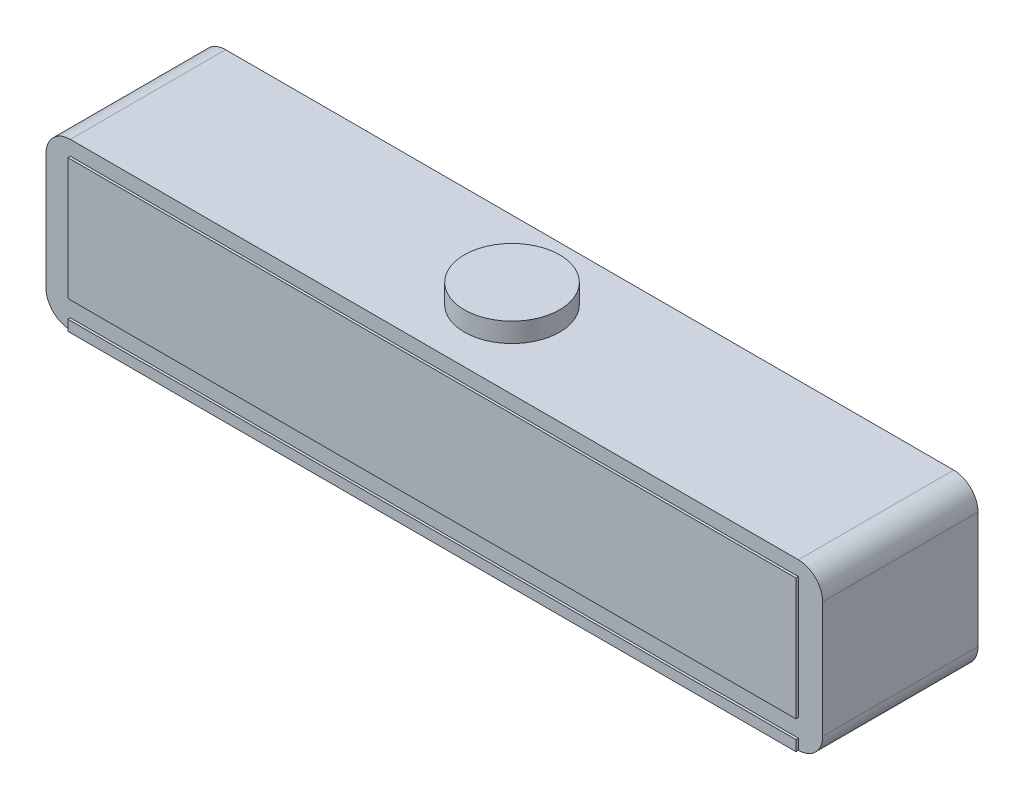
ISO-10303-21;
HEADER;
FILE_DESCRIPTION(('STEP AP214'),'2;1');
FILE_NAME('part.step','',(''),(''),'','','');
FILE_SCHEMA(('AUTOMOTIVE_DESIGN { 1 0 10303 214 1 1 1 1 }'));
ENDSEC;
DATA;
#1=APPLICATION_CONTEXT('core data for automotive mechanical design processes');
#2=APPLICATION_PROTOCOL_DEFINITION('international standard','automotive_design',2000,#1);
#3=PRODUCT_CONTEXT('',#1,'mechanical');
#4=PRODUCT('Part','Part','',(#3));
#5=PRODUCT_RELATED_PRODUCT_CATEGORY('part','',(#4));
#6=PRODUCT_DEFINITION_FORMATION('','',#4);
#7=PRODUCT_DEFINITION_CONTEXT('part definition',#1,'design');
#8=PRODUCT_DEFINITION('design','',#6,#7);
#9=PRODUCT_DEFINITION_SHAPE('','',#8);
#10=(LENGTH_UNIT() NAMED_UNIT(*) SI_UNIT(.MILLI.,.METRE.));
#11=(NAMED_UNIT(*) PLANE_ANGLE_UNIT() SI_UNIT($,.RADIAN.));
#12=(NAMED_UNIT(*) SI_UNIT($,.STERADIAN.) SOLID_ANGLE_UNIT());
#13=UNCERTAINTY_MEASURE_WITH_UNIT(LENGTH_MEASURE(1.E-05),#10,'distance_accuracy_value','');
#14=(GEOMETRIC_REPRESENTATION_CONTEXT(3) GLOBAL_UNCERTAINTY_ASSIGNED_CONTEXT((#13)) GLOBAL_UNIT_ASSIGNED_CONTEXT((#10,
#11,#12)) REPRESENTATION_CONTEXT('',''));
#15=CARTESIAN_POINT('',(0.,0.,0.));
#16=DIRECTION('',(0.,0.,1.));
#17=DIRECTION('',(1.,0.,0.));
#18=AXIS2_PLACEMENT_3D('',#15,#16,#17);
#19=CARTESIAN_POINT('',(-133.577981651376,68.,65.6880733944954));
#20=DIRECTION('',(0.,0.,-1.));
#21=DIRECTION('',(-1.,0.,0.));
#22=AXIS2_PLACEMENT_3D('',#19,#20,#21);
#23=PLANE('',#22);
#24=DIRECTION('',(0.,-1.,0.));
#25=VECTOR('',#24,1.);
#26=CARTESIAN_POINT('',(-123.577981651376,62.,65.6880733944954));
#27=LINE('',#26,#25);
#28=CARTESIAN_POINT('',(-123.577981651376,62.,65.6880733944954));
#29=VERTEX_POINT('',#28);
#30=CARTESIAN_POINT('',(-123.577981651376,11.7120477058628,65.6880733944954));
#31=VERTEX_POINT('',#30);
#32=EDGE_CURVE('E173',#29,#31,#27,.T.);
#33=ORIENTED_EDGE('',*,*,#32,.F.);
#34=DIRECTION('',(-1.,0.,0.));
#35=VECTOR('',#34,1.);
#36=CARTESIAN_POINT('',(-123.577981651376,62.,65.6880733944954));
#37=LINE('',#36,#35);
#38=CARTESIAN_POINT('',(176.422018348624,62.,65.6880733944954));
#39=VERTEX_POINT('',#38);
#40=EDGE_CURVE('E189',#39,#29,#37,.T.);
#41=ORIENTED_EDGE('',*,*,#40,.F.);
#42=DIRECTION('',(0.,1.,0.));
#43=VECTOR('',#42,1.);
#44=CARTESIAN_POINT('',(176.422018348624,62.,65.6880733944954));
#45=LINE('',#44,#43);
#46=CARTESIAN_POINT('',(176.422018348624,11.7120477058628,65.6880733944954));
#47=VERTEX_POINT('',#46);
#48=EDGE_CURVE('E202',#47,#39,#45,.T.);
#49=ORIENTED_EDGE('',*,*,#48,.F.);
#50=DIRECTION('',(1.,0.,0.));
#51=VECTOR('',#50,1.);
#52=CARTESIAN_POINT('',(-123.577981651376,11.7120477058628,65.6880733944954));
#53=LINE('',#52,#51);
#54=EDGE_CURVE('E178',#31,#47,#53,.T.);
#55=ORIENTED_EDGE('',*,*,#54,.F.);
#56=EDGE_LOOP('',(#33,#41,#49,#55));
#57=FACE_BOUND('',#56,.T.);
#58=DIRECTION('',(0.,-1.,0.));
#59=VECTOR('',#58,1.);
#60=CARTESIAN_POINT('',(-123.577981651376,4.34472349604082,65.6880733944954));
#61=LINE('',#60,#59);
#62=CARTESIAN_POINT('',(-123.577981651376,4.34472349604081,65.6880733944954));
#63=VERTEX_POINT('',#62);
#64=CARTESIAN_POINT('',(-123.577981651376,0.,65.6880733944954));
#65=VERTEX_POINT('',#64);
#66=EDGE_CURVE('E56',#63,#65,#61,.T.);
#67=ORIENTED_EDGE('',*,*,#66,.F.);
#68=DIRECTION('',(-1.,0.,0.));
#69=VECTOR('',#68,1.);
#70=CARTESIAN_POINT('',(-123.577981651376,4.34472349604082,65.6880733944954));
#71=LINE('',#70,#69);
#72=CARTESIAN_POINT('',(176.422018348624,4.34472349604081,65.6880733944954));
#73=VERTEX_POINT('',#72);
#74=EDGE_CURVE('E60',#73,#63,#71,.T.);
#75=ORIENTED_EDGE('',*,*,#74,.F.);
#76=DIRECTION('',(0.,1.,0.));
#77=VECTOR('',#76,1.);
#78=CARTESIAN_POINT('',(176.422018348624,4.34472349604082,65.6880733944954));
#79=LINE('',#78,#77);
#80=CARTESIAN_POINT('',(176.422018348624,0.,65.6880733944954));
#81=VERTEX_POINT('',#80);
#82=EDGE_CURVE('E527',#81,#73,#79,.T.);
#83=ORIENTED_EDGE('',*,*,#82,.F.);
#84=CARTESIAN_POINT('',(176.422018348624,10.,65.6880733944954));
#85=DIRECTION('',(0.,0.,-1.));
#86=DIRECTION('',(-1.,0.,0.));
#87=AXIS2_PLACEMENT_3D('',#84,#85,#86);
#88=CIRCLE('',#87,10.);
#89=CARTESIAN_POINT('',(186.422018348624,10.,65.6880733944954));
#90=VERTEX_POINT('',#89);
#91=EDGE_CURVE('E294',#81,#90,#88,.F.);
#92=ORIENTED_EDGE('',*,*,#91,.T.);
#93=DIRECTION('',(0.,-1.,0.));
#94=VECTOR('',#93,1.);
#95=CARTESIAN_POINT('',(186.422018348624,68.,65.6880733944954));
#96=LINE('',#95,#94);
#97=CARTESIAN_POINT('',(186.422018348624,58.,65.6880733944954));
#98=VERTEX_POINT('',#97);
#99=EDGE_CURVE('E252',#98,#90,#96,.T.);
#100=ORIENTED_EDGE('',*,*,#99,.F.);
#101=CARTESIAN_POINT('',(176.422018348624,58.,65.6880733944954));
#102=DIRECTION('',(0.,0.,-1.));
#103=DIRECTION('',(-1.,0.,0.));
#104=AXIS2_PLACEMENT_3D('',#101,#102,#103);
#105=CIRCLE('',#104,10.);
#106=CARTESIAN_POINT('',(176.422018348624,68.,65.6880733944954));
#107=VERTEX_POINT('',#106);
#108=EDGE_CURVE('E291',#98,#107,#105,.F.);
#109=ORIENTED_EDGE('',*,*,#108,.T.);
#110=DIRECTION('',(1.,0.,0.));
#111=VECTOR('',#110,1.);
#112=CARTESIAN_POINT('',(-133.577981651376,68.,65.6880733944954));
#113=LINE('',#112,#111);
#114=CARTESIAN_POINT('',(-123.577981651376,68.,65.6880733944954));
#115=VERTEX_POINT('',#114);
#116=EDGE_CURVE('E233',#115,#107,#113,.T.);
#117=ORIENTED_EDGE('',*,*,#116,.F.);
#118=CARTESIAN_POINT('',(-123.577981651376,58.,65.6880733944954));
#119=DIRECTION('',(0.,0.,-1.));
#120=DIRECTION('',(-1.,0.,0.));
#121=AXIS2_PLACEMENT_3D('',#118,#119,#120);
#122=CIRCLE('',#121,10.);
#123=CARTESIAN_POINT('',(-133.577981651376,58.,65.6880733944954));
#124=VERTEX_POINT('',#123);
#125=EDGE_CURVE('E285',#115,#124,#122,.F.);
#126=ORIENTED_EDGE('',*,*,#125,.T.);
#127=DIRECTION('',(0.,-1.,0.));
#128=VECTOR('',#127,1.);
#129=CARTESIAN_POINT('',(-133.577981651376,68.,65.6880733944954));
#130=LINE('',#129,#128);
#131=CARTESIAN_POINT('',(-133.577981651376,10.,65.6880733944954));
#132=VERTEX_POINT('',#131);
#133=EDGE_CURVE('E256',#124,#132,#130,.T.);
#134=ORIENTED_EDGE('',*,*,#133,.T.);
#135=CARTESIAN_POINT('',(-123.577981651376,10.,65.6880733944954));
#136=DIRECTION('',(0.,0.,-1.));
#137=DIRECTION('',(-1.,0.,0.));
#138=AXIS2_PLACEMENT_3D('',#135,#136,#137);
#139=CIRCLE('',#138,10.);
#140=EDGE_CURVE('E288',#132,#65,#139,.F.);
#141=ORIENTED_EDGE('',*,*,#140,.T.);
#142=EDGE_LOOP('',(#67,#75,#83,#92,#100,#109,#117,#126,#134,#141));
#143=FACE_BOUND('',#142,.T.);
#144=ADVANCED_FACE('F40',(#57,#143),#23,.F.);
#145=CARTESIAN_POINT('',(-133.577981651376,68.,1.68807339449543));
#146=DIRECTION('',(1.,0.,0.));
#147=DIRECTION('',(0.,0.,-1.));
#148=AXIS2_PLACEMENT_3D('',#145,#146,#147);
#149=PLANE('',#148);
#150=DIRECTION('',(0.,-1.,0.));
#151=VECTOR('',#150,1.);
#152=CARTESIAN_POINT('',(-133.577981651376,68.,1.68807339449543));
#153=LINE('',#152,#151);
#154=CARTESIAN_POINT('',(-133.577981651376,58.,1.68807339449543));
#155=VERTEX_POINT('',#154);
#156=CARTESIAN_POINT('',(-133.577981651376,10.,1.68807339449543));
#157=VERTEX_POINT('',#156);
#158=EDGE_CURVE('E241',#155,#157,#153,.T.);
#159=ORIENTED_EDGE('',*,*,#158,.T.);
#160=DIRECTION('',(0.,0.,1.));
#161=VECTOR('',#160,1.);
#162=CARTESIAN_POINT('',(-133.577981651376,10.,1.68807339449543));
#163=LINE('',#162,#161);
#164=EDGE_CURVE('E11',#157,#132,#163,.T.);
#165=ORIENTED_EDGE('',*,*,#164,.T.);
#166=ORIENTED_EDGE('',*,*,#133,.F.);
#167=DIRECTION('',(0.,0.,1.));
#168=VECTOR('',#167,1.);
#169=CARTESIAN_POINT('',(-133.577981651376,58.,1.68807339449543));
#170=LINE('',#169,#168);
#171=EDGE_CURVE('E49',#124,#155,#170,.F.);
#172=ORIENTED_EDGE('',*,*,#171,.T.);
#173=EDGE_LOOP('',(#159,#165,#166,#172));
#174=FACE_BOUND('',#173,.T.);
#175=ADVANCED_FACE('F309',(#174),#149,.F.);
#176=CARTESIAN_POINT('',(186.422018348624,68.,1.68807339449543));
#177=DIRECTION('',(-1.,0.,0.));
#178=DIRECTION('',(0.,0.,1.));
#179=AXIS2_PLACEMENT_3D('',#176,#177,#178);
#180=PLANE('',#179);
#181=ORIENTED_EDGE('',*,*,#99,.T.);
#182=DIRECTION('',(0.,0.,-1.));
#183=VECTOR('',#182,1.);
#184=CARTESIAN_POINT('',(186.422018348624,10.,1.68807339449543));
#185=LINE('',#184,#183);
#186=CARTESIAN_POINT('',(186.422018348624,10.,1.68807339449543));
#187=VERTEX_POINT('',#186);
#188=EDGE_CURVE('E263',#90,#187,#185,.T.);
#189=ORIENTED_EDGE('',*,*,#188,.T.);
#190=DIRECTION('',(0.,-1.,0.));
#191=VECTOR('',#190,1.);
#192=CARTESIAN_POINT('',(186.422018348624,68.,1.68807339449543));
#193=LINE('',#192,#191);
#194=CARTESIAN_POINT('',(186.422018348624,58.,1.68807339449543));
#195=VERTEX_POINT('',#194);
#196=EDGE_CURVE('E248',#195,#187,#193,.T.);
#197=ORIENTED_EDGE('',*,*,#196,.F.);
#198=DIRECTION('',(0.,0.,-1.));
#199=VECTOR('',#198,1.);
#200=CARTESIAN_POINT('',(186.422018348624,58.,65.6880733944954));
#201=LINE('',#200,#199);
#202=EDGE_CURVE('E260',#195,#98,#201,.F.);
#203=ORIENTED_EDGE('',*,*,#202,.T.);
#204=EDGE_LOOP('',(#181,#189,#197,#203));
#205=FACE_BOUND('',#204,.T.);
#206=ADVANCED_FACE('F329',(#205),#180,.F.);
#207=CARTESIAN_POINT('',(-133.577981651376,68.,1.68807339449543));
#208=DIRECTION('',(0.,0.,1.));
#209=DIRECTION('',(1.,0.,0.));
#210=AXIS2_PLACEMENT_3D('',#207,#208,#209);
#211=PLANE('',#210);
#212=ORIENTED_EDGE('',*,*,#196,.T.);
#213=CARTESIAN_POINT('',(176.422018348624,10.,1.68807339449543));
#214=DIRECTION('',(0.,0.,1.));
#215=DIRECTION('',(1.,0.,0.));
#216=AXIS2_PLACEMENT_3D('',#213,#214,#215);
#217=CIRCLE('',#216,10.);
#218=CARTESIAN_POINT('',(176.422018348624,0.,1.68807339449543));
#219=VERTEX_POINT('',#218);
#220=EDGE_CURVE('E276',#187,#219,#217,.F.);
#221=ORIENTED_EDGE('',*,*,#220,.T.);
#222=DIRECTION('',(-1.,0.,0.));
#223=VECTOR('',#222,1.);
#224=CARTESIAN_POINT('',(-133.577981651376,0.,1.68807339449543));
#225=LINE('',#224,#223);
#226=CARTESIAN_POINT('',(-123.577981651376,0.,1.68807339449543));
#227=VERTEX_POINT('',#226);
#228=EDGE_CURVE('E229',#219,#227,#225,.T.);
#229=ORIENTED_EDGE('',*,*,#228,.T.);
#230=CARTESIAN_POINT('',(-123.577981651376,10.,1.68807339449543));
#231=DIRECTION('',(0.,0.,1.));
#232=DIRECTION('',(1.,0.,0.));
#233=AXIS2_PLACEMENT_3D('',#230,#231,#232);
#234=CIRCLE('',#233,10.);
#235=EDGE_CURVE('E270',#227,#157,#234,.F.);
#236=ORIENTED_EDGE('',*,*,#235,.T.);
#237=ORIENTED_EDGE('',*,*,#158,.F.);
#238=CARTESIAN_POINT('',(-123.577981651376,58.,1.68807339449543));
#239=DIRECTION('',(0.,0.,1.));
#240=DIRECTION('',(1.,0.,0.));
#241=AXIS2_PLACEMENT_3D('',#238,#239,#240);
#242=CIRCLE('',#241,10.);
#243=CARTESIAN_POINT('',(-123.577981651376,68.,1.68807339449543));
#244=VERTEX_POINT('',#243);
#245=EDGE_CURVE('E267',#155,#244,#242,.F.);
#246=ORIENTED_EDGE('',*,*,#245,.T.);
#247=DIRECTION('',(-1.,0.,0.));
#248=VECTOR('',#247,1.);
#249=CARTESIAN_POINT('',(-133.577981651376,68.,1.68807339449543));
#250=LINE('',#249,#248);
#251=CARTESIAN_POINT('',(176.422018348624,68.,1.68807339449543));
#252=VERTEX_POINT('',#251);
#253=EDGE_CURVE('E237',#252,#244,#250,.T.);
#254=ORIENTED_EDGE('',*,*,#253,.F.);
#255=CARTESIAN_POINT('',(176.422018348624,58.,1.68807339449543));
#256=DIRECTION('',(0.,0.,1.));
#257=DIRECTION('',(1.,0.,0.));
#258=AXIS2_PLACEMENT_3D('',#255,#256,#257);
#259=CIRCLE('',#258,10.);
#260=EDGE_CURVE('E273',#252,#195,#259,.F.);
#261=ORIENTED_EDGE('',*,*,#260,.T.);
#262=EDGE_LOOP('',(#212,#221,#229,#236,#237,#246,#254,#261));
#263=FACE_BOUND('',#262,.T.);
#264=ADVANCED_FACE('F314',(#263),#211,.F.);
#265=CARTESIAN_POINT('',(0.,68.,0.));
#266=DIRECTION('',(0.,1.,0.));
#267=DIRECTION('',(0.,0.,1.));
#268=AXIS2_PLACEMENT_3D('',#265,#266,#267);
#269=PLANE('',#268);
#270=CARTESIAN_POINT('',(26.4220183486239,68.,33.6880733944954));
#271=DIRECTION('',(0.,1.,0.));
#272=DIRECTION('',(0.,0.,1.));
#273=AXIS2_PLACEMENT_3D('',#270,#271,#272);
#274=CIRCLE('',#273,19.624889804475);
#275=CARTESIAN_POINT('',(26.4220183486239,68.,53.3129631989705));
#276=VERTEX_POINT('',#275);
#277=EDGE_CURVE('E224',#276,#276,#274,.T.);
#278=ORIENTED_EDGE('',*,*,#277,.F.);
#279=EDGE_LOOP('',(#278));
#280=FACE_BOUND('',#279,.T.);
#281=ORIENTED_EDGE('',*,*,#116,.T.);
#282=DIRECTION('',(0.,0.,-1.));
#283=VECTOR('',#282,1.);
#284=CARTESIAN_POINT('',(176.422018348624,68.,1.68807339449544));
#285=LINE('',#284,#283);
#286=EDGE_CURVE('E301',#107,#252,#285,.T.);
#287=ORIENTED_EDGE('',*,*,#286,.T.);
#288=ORIENTED_EDGE('',*,*,#253,.T.);
#289=DIRECTION('',(0.,0.,1.));
#290=VECTOR('',#289,1.);
#291=CARTESIAN_POINT('',(-123.577981651376,68.,65.6880733944954));
#292=LINE('',#291,#290);
#293=EDGE_CURVE('E297',#244,#115,#292,.T.);
#294=ORIENTED_EDGE('',*,*,#293,.T.);
#295=EDGE_LOOP('',(#281,#287,#288,#294));
#296=FACE_BOUND('',#295,.T.);
#297=ADVANCED_FACE('F320',(#280,#296),#269,.T.);
#298=CARTESIAN_POINT('',(0.,0.,0.));
#299=DIRECTION('',(0.,1.,0.));
#300=DIRECTION('',(0.,0.,1.));
#301=AXIS2_PLACEMENT_3D('',#298,#299,#300);
#302=PLANE('',#301);
#303=ORIENTED_EDGE('',*,*,#228,.F.);
#304=DIRECTION('',(0.,0.,-1.));
#305=VECTOR('',#304,1.);
#306=CARTESIAN_POINT('',(176.422018348624,0.,0.));
#307=LINE('',#306,#305);
#308=EDGE_CURVE('E282',#219,#81,#307,.F.);
#309=ORIENTED_EDGE('',*,*,#308,.T.);
#310=DIRECTION('',(0.,0.,-1.));
#311=VECTOR('',#310,1.);
#312=CARTESIAN_POINT('',(176.422018348624,0.,66.6880733944954));
#313=LINE('',#312,#311);
#314=CARTESIAN_POINT('',(176.422018348624,0.,66.6880733944954));
#315=VERTEX_POINT('',#314);
#316=EDGE_CURVE('E155',#315,#81,#313,.T.);
#317=ORIENTED_EDGE('',*,*,#316,.F.);
#318=DIRECTION('',(1.,0.,0.));
#319=VECTOR('',#318,1.);
#320=CARTESIAN_POINT('',(-123.577981651376,0.,66.6880733944954));
#321=LINE('',#320,#319);
#322=CARTESIAN_POINT('',(-123.577981651376,0.,66.6880733944954));
#323=VERTEX_POINT('',#322);
#324=EDGE_CURVE('E147',#323,#315,#321,.T.);
#325=ORIENTED_EDGE('',*,*,#324,.F.);
#326=DIRECTION('',(0.,0.,-1.));
#327=VECTOR('',#326,1.);
#328=CARTESIAN_POINT('',(-123.577981651376,0.,66.6880733944954));
#329=LINE('',#328,#327);
#330=EDGE_CURVE('E152',#323,#65,#329,.T.);
#331=ORIENTED_EDGE('',*,*,#330,.T.);
#332=DIRECTION('',(0.,0.,1.));
#333=VECTOR('',#332,1.);
#334=CARTESIAN_POINT('',(-123.577981651376,0.,0.));
#335=LINE('',#334,#333);
#336=EDGE_CURVE('E279',#65,#227,#335,.F.);
#337=ORIENTED_EDGE('',*,*,#336,.T.);
#338=EDGE_LOOP('',(#303,#309,#317,#325,#331,#337));
#339=FACE_BOUND('',#338,.T.);
#340=ADVANCED_FACE('F150',(#339),#302,.F.);
#341=CARTESIAN_POINT('',(176.422018348624,10.,1.68807339449544));
#342=DIRECTION('',(0.,0.,-1.));
#343=DIRECTION('',(-1.,0.,0.));
#344=AXIS2_PLACEMENT_3D('',#341,#342,#343);
#345=CYLINDRICAL_SURFACE('',#344,10.);
#346=ORIENTED_EDGE('',*,*,#91,.F.);
#347=ORIENTED_EDGE('',*,*,#308,.F.);
#348=ORIENTED_EDGE('',*,*,#220,.F.);
#349=ORIENTED_EDGE('',*,*,#188,.F.);
#350=EDGE_LOOP('',(#346,#347,#348,#349));
#351=FACE_BOUND('',#350,.T.);
#352=ADVANCED_FACE('F332',(#351),#345,.T.);
#353=CARTESIAN_POINT('',(176.422018348624,58.,0.));
#354=DIRECTION('',(0.,0.,1.));
#355=DIRECTION('',(1.,0.,0.));
#356=AXIS2_PLACEMENT_3D('',#353,#354,#355);
#357=CYLINDRICAL_SURFACE('',#356,10.);
#358=ORIENTED_EDGE('',*,*,#108,.F.);
#359=ORIENTED_EDGE('',*,*,#202,.F.);
#360=ORIENTED_EDGE('',*,*,#260,.F.);
#361=ORIENTED_EDGE('',*,*,#286,.F.);
#362=EDGE_LOOP('',(#358,#359,#360,#361));
#363=FACE_BOUND('',#362,.T.);
#364=ADVANCED_FACE('F326',(#363),#357,.T.);
#365=CARTESIAN_POINT('',(-123.577981651376,10.,1.68807339449544));
#366=DIRECTION('',(0.,0.,1.));
#367=DIRECTION('',(1.,0.,0.));
#368=AXIS2_PLACEMENT_3D('',#365,#366,#367);
#369=CYLINDRICAL_SURFACE('',#368,10.);
#370=ORIENTED_EDGE('',*,*,#235,.F.);
#371=ORIENTED_EDGE('',*,*,#336,.F.);
#372=ORIENTED_EDGE('',*,*,#140,.F.);
#373=ORIENTED_EDGE('',*,*,#164,.F.);
#374=EDGE_LOOP('',(#370,#371,#372,#373));
#375=FACE_BOUND('',#374,.T.);
#376=ADVANCED_FACE('F336',(#375),#369,.T.);
#377=CARTESIAN_POINT('',(-123.577981651376,58.,0.));
#378=DIRECTION('',(0.,0.,-1.));
#379=DIRECTION('',(-1.,0.,0.));
#380=AXIS2_PLACEMENT_3D('',#377,#378,#379);
#381=CYLINDRICAL_SURFACE('',#380,10.);
#382=ORIENTED_EDGE('',*,*,#245,.F.);
#383=ORIENTED_EDGE('',*,*,#171,.F.);
#384=ORIENTED_EDGE('',*,*,#125,.F.);
#385=ORIENTED_EDGE('',*,*,#293,.F.);
#386=EDGE_LOOP('',(#382,#383,#384,#385));
#387=FACE_BOUND('',#386,.T.);
#388=ADVANCED_FACE('F42',(#387),#381,.T.);
#389=CARTESIAN_POINT('',(26.4220183486239,76.,33.6880733944954));
#390=DIRECTION('',(0.,-1.,0.));
#391=DIRECTION('',(0.,0.,-1.));
#392=AXIS2_PLACEMENT_3D('',#389,#390,#391);
#393=CYLINDRICAL_SURFACE('',#392,19.624889804475);
#394=CARTESIAN_POINT('',(26.4220183486239,76.,33.6880733944954));
#395=DIRECTION('',(0.,1.,0.));
#396=DIRECTION('',(0.,0.,1.));
#397=AXIS2_PLACEMENT_3D('',#394,#395,#396);
#398=CIRCLE('',#397,19.624889804475);
#399=CARTESIAN_POINT('',(26.4220183486239,76.,53.3129631989705));
#400=VERTEX_POINT('',#399);
#401=EDGE_CURVE('E225',#400,#400,#398,.T.);
#402=ORIENTED_EDGE('',*,*,#401,.F.);
#403=EDGE_LOOP('',(#402));
#404=FACE_BOUND('',#403,.T.);
#405=ORIENTED_EDGE('',*,*,#277,.T.);
#406=EDGE_LOOP('',(#405));
#407=FACE_BOUND('',#406,.T.);
#408=ADVANCED_FACE('F342',(#404,#407),#393,.T.);
#409=CARTESIAN_POINT('',(26.4220183486239,76.,33.6880733944954));
#410=DIRECTION('',(0.,1.,0.));
#411=DIRECTION('',(0.,0.,1.));
#412=AXIS2_PLACEMENT_3D('',#409,#410,#411);
#413=PLANE('',#412);
#414=ORIENTED_EDGE('',*,*,#401,.T.);
#415=EDGE_LOOP('',(#414));
#416=FACE_BOUND('',#415,.T.);
#417=ADVANCED_FACE('F423',(#416),#413,.T.);
#418=CARTESIAN_POINT('',(-123.577981651376,62.,66.6880733944954));
#419=DIRECTION('',(1.,0.,0.));
#420=DIRECTION('',(0.,1.,0.));
#421=AXIS2_PLACEMENT_3D('',#418,#419,#420);
#422=PLANE('',#421);
#423=ORIENTED_EDGE('',*,*,#32,.T.);
#424=DIRECTION('',(0.,0.,-1.));
#425=VECTOR('',#424,1.);
#426=CARTESIAN_POINT('',(-123.577981651376,11.7120477058628,66.6880733944954));
#427=LINE('',#426,#425);
#428=CARTESIAN_POINT('',(-123.577981651376,11.7120477058628,66.6880733944954));
#429=VERTEX_POINT('',#428);
#430=EDGE_CURVE('E220',#429,#31,#427,.T.);
#431=ORIENTED_EDGE('',*,*,#430,.F.);
#432=DIRECTION('',(0.,-1.,0.));
#433=VECTOR('',#432,1.);
#434=CARTESIAN_POINT('',(-123.577981651376,62.,66.6880733944954));
#435=LINE('',#434,#433);
#436=CARTESIAN_POINT('',(-123.577981651376,62.,66.6880733944954));
#437=VERTEX_POINT('',#436);
#438=EDGE_CURVE('E184',#437,#429,#435,.T.);
#439=ORIENTED_EDGE('',*,*,#438,.F.);
#440=DIRECTION('',(0.,0.,-1.));
#441=VECTOR('',#440,1.);
#442=CARTESIAN_POINT('',(-123.577981651376,62.,66.6880733944954));
#443=LINE('',#442,#441);
#444=EDGE_CURVE('E197',#437,#29,#443,.T.);
#445=ORIENTED_EDGE('',*,*,#444,.T.);
#446=EDGE_LOOP('',(#423,#431,#439,#445));
#447=FACE_BOUND('',#446,.T.);
#448=ADVANCED_FACE('F430',(#447),#422,.F.);
#449=CARTESIAN_POINT('',(-123.577981651376,11.7120477058628,66.6880733944954));
#450=DIRECTION('',(0.,1.,0.));
#451=DIRECTION('',(0.,0.,1.));
#452=AXIS2_PLACEMENT_3D('',#449,#450,#451);
#453=PLANE('',#452);
#454=ORIENTED_EDGE('',*,*,#54,.T.);
#455=DIRECTION('',(0.,0.,-1.));
#456=VECTOR('',#455,1.);
#457=CARTESIAN_POINT('',(176.422018348624,11.7120477058628,66.6880733944954));
#458=LINE('',#457,#456);
#459=CARTESIAN_POINT('',(176.422018348624,11.7120477058628,66.6880733944954));
#460=VERTEX_POINT('',#459);
#461=EDGE_CURVE('E216',#460,#47,#458,.T.);
#462=ORIENTED_EDGE('',*,*,#461,.F.);
#463=DIRECTION('',(1.,0.,0.));
#464=VECTOR('',#463,1.);
#465=CARTESIAN_POINT('',(-123.577981651376,11.7120477058628,66.6880733944954));
#466=LINE('',#465,#464);
#467=EDGE_CURVE('E188',#429,#460,#466,.T.);
#468=ORIENTED_EDGE('',*,*,#467,.F.);
#469=ORIENTED_EDGE('',*,*,#430,.T.);
#470=EDGE_LOOP('',(#454,#462,#468,#469));
#471=FACE_BOUND('',#470,.T.);
#472=ADVANCED_FACE('F443',(#471),#453,.F.);
#473=CARTESIAN_POINT('',(176.422018348624,62.,66.6880733944954));
#474=DIRECTION('',(-1.,0.,0.));
#475=DIRECTION('',(0.,-1.,0.));
#476=AXIS2_PLACEMENT_3D('',#473,#474,#475);
#477=PLANE('',#476);
#478=ORIENTED_EDGE('',*,*,#48,.T.);
#479=DIRECTION('',(0.,0.,-1.));
#480=VECTOR('',#479,1.);
#481=CARTESIAN_POINT('',(176.422018348624,62.,66.6880733944954));
#482=LINE('',#481,#480);
#483=CARTESIAN_POINT('',(176.422018348624,62.,66.6880733944954));
#484=VERTEX_POINT('',#483);
#485=EDGE_CURVE('E212',#484,#39,#482,.T.);
#486=ORIENTED_EDGE('',*,*,#485,.F.);
#487=DIRECTION('',(0.,1.,0.));
#488=VECTOR('',#487,1.);
#489=CARTESIAN_POINT('',(176.422018348624,62.,66.6880733944954));
#490=LINE('',#489,#488);
#491=EDGE_CURVE('E192',#460,#484,#490,.T.);
#492=ORIENTED_EDGE('',*,*,#491,.F.);
#493=ORIENTED_EDGE('',*,*,#461,.T.);
#494=EDGE_LOOP('',(#478,#486,#492,#493));
#495=FACE_BOUND('',#494,.T.);
#496=ADVANCED_FACE('F450',(#495),#477,.F.);
#497=CARTESIAN_POINT('',(-123.577981651376,62.,66.6880733944954));
#498=DIRECTION('',(0.,-1.,0.));
#499=DIRECTION('',(0.,0.,-1.));
#500=AXIS2_PLACEMENT_3D('',#497,#498,#499);
#501=PLANE('',#500);
#502=ORIENTED_EDGE('',*,*,#40,.T.);
#503=ORIENTED_EDGE('',*,*,#444,.F.);
#504=DIRECTION('',(-1.,0.,0.));
#505=VECTOR('',#504,1.);
#506=CARTESIAN_POINT('',(-123.577981651376,62.,66.6880733944954));
#507=LINE('',#506,#505);
#508=EDGE_CURVE('E195',#484,#437,#507,.T.);
#509=ORIENTED_EDGE('',*,*,#508,.F.);
#510=ORIENTED_EDGE('',*,*,#485,.T.);
#511=EDGE_LOOP('',(#502,#503,#509,#510));
#512=FACE_BOUND('',#511,.T.);
#513=ADVANCED_FACE('F458',(#512),#501,.F.);
#514=CARTESIAN_POINT('',(0.,0.,66.6880733944954));
#515=DIRECTION('',(0.,0.,1.));
#516=DIRECTION('',(1.,0.,0.));
#517=AXIS2_PLACEMENT_3D('',#514,#515,#516);
#518=PLANE('',#517);
#519=ORIENTED_EDGE('',*,*,#438,.T.);
#520=ORIENTED_EDGE('',*,*,#467,.T.);
#521=ORIENTED_EDGE('',*,*,#491,.T.);
#522=ORIENTED_EDGE('',*,*,#508,.T.);
#523=EDGE_LOOP('',(#519,#520,#521,#522));
#524=FACE_BOUND('',#523,.T.);
#525=ADVANCED_FACE('F466',(#524),#518,.T.);
#526=CARTESIAN_POINT('',(-123.577981651376,4.34472349604082,66.6880733944954));
#527=DIRECTION('',(1.,0.,0.));
#528=DIRECTION('',(0.,0.,-1.));
#529=AXIS2_PLACEMENT_3D('',#526,#527,#528);
#530=PLANE('',#529);
#531=ORIENTED_EDGE('',*,*,#66,.T.);
#532=ORIENTED_EDGE('',*,*,#330,.F.);
#533=DIRECTION('',(0.,-1.,0.));
#534=VECTOR('',#533,1.);
#535=CARTESIAN_POINT('',(-123.577981651376,4.34472349604082,66.6880733944954));
#536=LINE('',#535,#534);
#537=CARTESIAN_POINT('',(-123.577981651376,4.34472349604082,66.6880733944954));
#538=VERTEX_POINT('',#537);
#539=EDGE_CURVE('E160',#538,#323,#536,.T.);
#540=ORIENTED_EDGE('',*,*,#539,.F.);
#541=DIRECTION('',(0.,0.,-1.));
#542=VECTOR('',#541,1.);
#543=CARTESIAN_POINT('',(-123.577981651376,4.34472349604082,66.6880733944954));
#544=LINE('',#543,#542);
#545=EDGE_CURVE('E524',#538,#63,#544,.T.);
#546=ORIENTED_EDGE('',*,*,#545,.T.);
#547=EDGE_LOOP('',(#531,#532,#540,#546));
#548=FACE_BOUND('',#547,.T.);
#549=ADVANCED_FACE('F171',(#548),#530,.F.);
#550=CARTESIAN_POINT('',(176.422018348624,4.34472349604082,66.6880733944954));
#551=DIRECTION('',(-1.,0.,0.));
#552=DIRECTION('',(0.,0.,1.));
#553=AXIS2_PLACEMENT_3D('',#550,#551,#552);
#554=PLANE('',#553);
#555=ORIENTED_EDGE('',*,*,#82,.T.);
#556=DIRECTION('',(0.,0.,-1.));
#557=VECTOR('',#556,1.);
#558=CARTESIAN_POINT('',(176.422018348624,4.34472349604082,66.6880733944954));
#559=LINE('',#558,#557);
#560=CARTESIAN_POINT('',(176.422018348624,4.34472349604082,66.6880733944954));
#561=VERTEX_POINT('',#560);
#562=EDGE_CURVE('E180',#561,#73,#559,.T.);
#563=ORIENTED_EDGE('',*,*,#562,.F.);
#564=DIRECTION('',(0.,1.,0.));
#565=VECTOR('',#564,1.);
#566=CARTESIAN_POINT('',(176.422018348624,4.34472349604082,66.6880733944954));
#567=LINE('',#566,#565);
#568=EDGE_CURVE('E159',#315,#561,#567,.T.);
#569=ORIENTED_EDGE('',*,*,#568,.F.);
#570=ORIENTED_EDGE('',*,*,#316,.T.);
#571=EDGE_LOOP('',(#555,#563,#569,#570));
#572=FACE_BOUND('',#571,.T.);
#573=ADVANCED_FACE('F481',(#572),#554,.F.);
#574=CARTESIAN_POINT('',(-123.577981651376,4.34472349604082,66.6880733944954));
#575=DIRECTION('',(0.,-1.,0.));
#576=DIRECTION('',(0.,0.,-1.));
#577=AXIS2_PLACEMENT_3D('',#574,#575,#576);
#578=PLANE('',#577);
#579=ORIENTED_EDGE('',*,*,#74,.T.);
#580=ORIENTED_EDGE('',*,*,#545,.F.);
#581=DIRECTION('',(-1.,0.,0.));
#582=VECTOR('',#581,1.);
#583=CARTESIAN_POINT('',(-123.577981651376,4.34472349604082,66.6880733944954));
#584=LINE('',#583,#582);
#585=EDGE_CURVE('E165',#561,#538,#584,.T.);
#586=ORIENTED_EDGE('',*,*,#585,.F.);
#587=ORIENTED_EDGE('',*,*,#562,.T.);
#588=EDGE_LOOP('',(#579,#580,#586,#587));
#589=FACE_BOUND('',#588,.T.);
#590=ADVANCED_FACE('F488',(#589),#578,.F.);
#591=CARTESIAN_POINT('',(0.,0.,66.6880733944954));
#592=DIRECTION('',(0.,0.,1.));
#593=DIRECTION('',(1.,0.,0.));
#594=AXIS2_PLACEMENT_3D('',#591,#592,#593);
#595=PLANE('',#594);
#596=ORIENTED_EDGE('',*,*,#539,.T.);
#597=ORIENTED_EDGE('',*,*,#324,.T.);
#598=ORIENTED_EDGE('',*,*,#568,.T.);
#599=ORIENTED_EDGE('',*,*,#585,.T.);
#600=EDGE_LOOP('',(#596,#597,#598,#599));
#601=FACE_BOUND('',#600,.T.);
#602=ADVANCED_FACE('F163',(#601),#595,.T.);
#603=CLOSED_SHELL('',(#144,#175,#206,#264,#297,#340,#352,#364,#376,#388,#408,#417,#448,#472,
#496,#513,#525,#549,#573,#590,#602));
#604=MANIFOLD_SOLID_BREP('B2',#603);
#605=ADVANCED_BREP_SHAPE_REPRESENTATION('',(#18,#604),#14);
#606=SHAPE_DEFINITION_REPRESENTATION(#9,#605);
ENDSEC;
END-ISO-10303-21;
